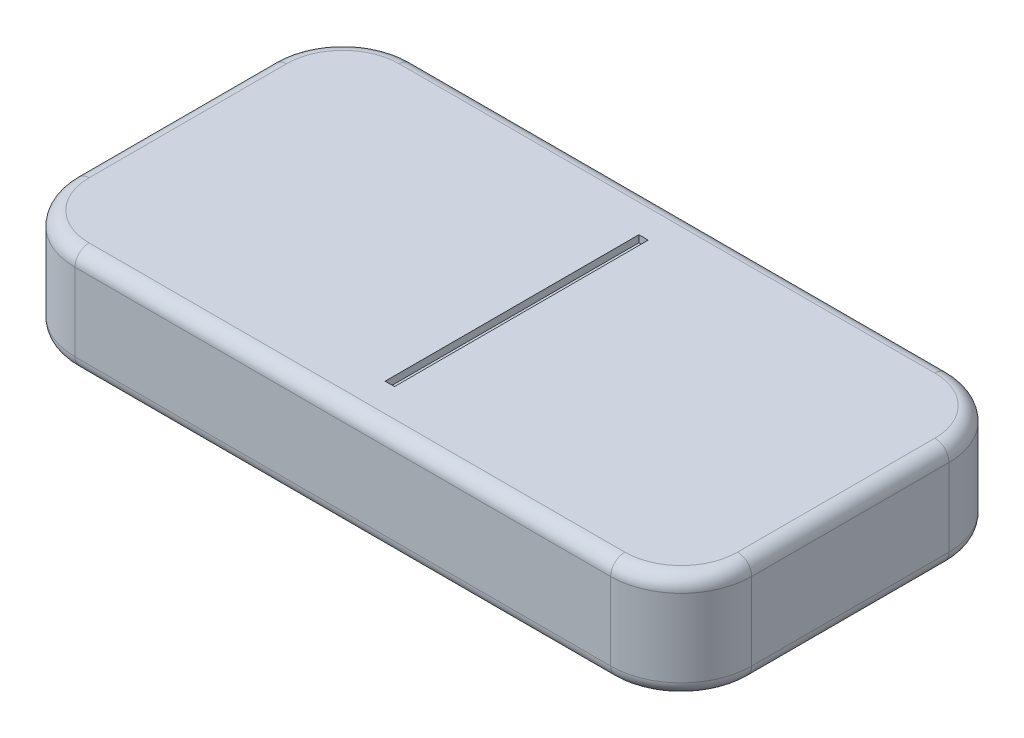
ISO-10303-21;
HEADER;
FILE_DESCRIPTION(('STEP AP214'),'2;1');
FILE_NAME('part.step','',(''),(''),'','','');
FILE_SCHEMA(('AUTOMOTIVE_DESIGN { 1 0 10303 214 1 1 1 1 }'));
ENDSEC;
DATA;
#1=APPLICATION_CONTEXT('core data for automotive mechanical design processes');
#2=APPLICATION_PROTOCOL_DEFINITION('international standard','automotive_design',2000,#1);
#3=PRODUCT_CONTEXT('',#1,'mechanical');
#4=PRODUCT('Part','Part','',(#3));
#5=PRODUCT_RELATED_PRODUCT_CATEGORY('part','',(#4));
#6=PRODUCT_DEFINITION_FORMATION('','',#4);
#7=PRODUCT_DEFINITION_CONTEXT('part definition',#1,'design');
#8=PRODUCT_DEFINITION('design','',#6,#7);
#9=PRODUCT_DEFINITION_SHAPE('','',#8);
#10=(LENGTH_UNIT() NAMED_UNIT(*) SI_UNIT(.MILLI.,.METRE.));
#11=(NAMED_UNIT(*) PLANE_ANGLE_UNIT() SI_UNIT($,.RADIAN.));
#12=(NAMED_UNIT(*) SI_UNIT($,.STERADIAN.) SOLID_ANGLE_UNIT());
#13=UNCERTAINTY_MEASURE_WITH_UNIT(LENGTH_MEASURE(1.E-05),#10,'distance_accuracy_value','');
#14=(GEOMETRIC_REPRESENTATION_CONTEXT(3) GLOBAL_UNCERTAINTY_ASSIGNED_CONTEXT((#13)) GLOBAL_UNIT_ASSIGNED_CONTEXT((#10,
#11,#12)) REPRESENTATION_CONTEXT('',''));
#15=CARTESIAN_POINT('',(0.,0.,0.));
#16=DIRECTION('',(0.,0.,1.));
#17=DIRECTION('',(1.,0.,0.));
#18=AXIS2_PLACEMENT_3D('',#15,#16,#17);
#19=CARTESIAN_POINT('',(0.,7.5,0.));
#20=DIRECTION('',(1.,0.,0.));
#21=DIRECTION('',(0.,0.,-1.));
#22=AXIS2_PLACEMENT_3D('',#19,#20,#21);
#23=PLANE('',#22);
#24=DIRECTION('',(0.,-1.,0.));
#25=VECTOR('',#24,1.);
#26=CARTESIAN_POINT('',(0.,7.5,-19.));
#27=LINE('',#26,#25);
#28=CARTESIAN_POINT('',(0.,6.5,-19.));
#29=VERTEX_POINT('',#28);
#30=CARTESIAN_POINT('',(0.,1.,-19.));
#31=VERTEX_POINT('',#30);
#32=EDGE_CURVE('E247',#29,#31,#27,.T.);
#33=ORIENTED_EDGE('',*,*,#32,.T.);
#34=DIRECTION('',(0.,0.,1.));
#35=VECTOR('',#34,1.);
#36=CARTESIAN_POINT('',(0.,1.,-5.));
#37=LINE('',#36,#35);
#38=CARTESIAN_POINT('',(0.,1.,-5.));
#39=VERTEX_POINT('',#38);
#40=EDGE_CURVE('E378',#31,#39,#37,.T.);
#41=ORIENTED_EDGE('',*,*,#40,.T.);
#42=DIRECTION('',(0.,-1.,0.));
#43=VECTOR('',#42,1.);
#44=CARTESIAN_POINT('',(0.,7.5,-5.));
#45=LINE('',#44,#43);
#46=CARTESIAN_POINT('',(0.,6.5,-5.));
#47=VERTEX_POINT('',#46);
#48=EDGE_CURVE('E251',#39,#47,#45,.F.);
#49=ORIENTED_EDGE('',*,*,#48,.T.);
#50=DIRECTION('',(0.,0.,1.));
#51=VECTOR('',#50,1.);
#52=CARTESIAN_POINT('',(0.,6.5,0.));
#53=LINE('',#52,#51);
#54=EDGE_CURVE('E297',#47,#29,#53,.F.);
#55=ORIENTED_EDGE('',*,*,#54,.T.);
#56=EDGE_LOOP('',(#33,#41,#49,#55));
#57=FACE_BOUND('',#56,.T.);
#58=ADVANCED_FACE('F36',(#57),#23,.F.);
#59=CARTESIAN_POINT('',(0.,7.5,0.));
#60=DIRECTION('',(0.,0.,-1.));
#61=DIRECTION('',(-1.,0.,0.));
#62=AXIS2_PLACEMENT_3D('',#59,#60,#61);
#63=PLANE('',#62);
#64=DIRECTION('',(0.,-1.,0.));
#65=VECTOR('',#64,1.);
#66=CARTESIAN_POINT('',(5.,7.5,0.));
#67=LINE('',#66,#65);
#68=CARTESIAN_POINT('',(5.,6.5,0.));
#69=VERTEX_POINT('',#68);
#70=CARTESIAN_POINT('',(5.,1.,0.));
#71=VERTEX_POINT('',#70);
#72=EDGE_CURVE('E234',#69,#71,#67,.T.);
#73=ORIENTED_EDGE('',*,*,#72,.T.);
#74=DIRECTION('',(1.,0.,0.));
#75=VECTOR('',#74,1.);
#76=CARTESIAN_POINT('',(43.,1.,0.));
#77=LINE('',#76,#75);
#78=CARTESIAN_POINT('',(43.,1.,0.));
#79=VERTEX_POINT('',#78);
#80=EDGE_CURVE('E372',#71,#79,#77,.T.);
#81=ORIENTED_EDGE('',*,*,#80,.T.);
#82=DIRECTION('',(0.,-1.,0.));
#83=VECTOR('',#82,1.);
#84=CARTESIAN_POINT('',(43.,7.5,0.));
#85=LINE('',#84,#83);
#86=CARTESIAN_POINT('',(43.,6.5,0.));
#87=VERTEX_POINT('',#86);
#88=EDGE_CURVE('E238',#79,#87,#85,.F.);
#89=ORIENTED_EDGE('',*,*,#88,.T.);
#90=DIRECTION('',(1.,0.,0.));
#91=VECTOR('',#90,1.);
#92=CARTESIAN_POINT('',(0.,6.5,0.));
#93=LINE('',#92,#91);
#94=EDGE_CURVE('E290',#87,#69,#93,.F.);
#95=ORIENTED_EDGE('',*,*,#94,.T.);
#96=EDGE_LOOP('',(#73,#81,#89,#95));
#97=FACE_BOUND('',#96,.T.);
#98=ADVANCED_FACE('F427',(#97),#63,.F.);
#99=CARTESIAN_POINT('',(48.,7.5,0.));
#100=DIRECTION('',(-1.,0.,0.));
#101=DIRECTION('',(0.,0.,1.));
#102=AXIS2_PLACEMENT_3D('',#99,#100,#101);
#103=PLANE('',#102);
#104=DIRECTION('',(0.,-1.,0.));
#105=VECTOR('',#104,1.);
#106=CARTESIAN_POINT('',(48.,7.5,-5.));
#107=LINE('',#106,#105);
#108=CARTESIAN_POINT('',(48.,6.5,-5.));
#109=VERTEX_POINT('',#108);
#110=CARTESIAN_POINT('',(48.,1.,-5.));
#111=VERTEX_POINT('',#110);
#112=EDGE_CURVE('E229',#109,#111,#107,.T.);
#113=ORIENTED_EDGE('',*,*,#112,.T.);
#114=DIRECTION('',(0.,0.,-1.));
#115=VECTOR('',#114,1.);
#116=CARTESIAN_POINT('',(48.,1.,-19.));
#117=LINE('',#116,#115);
#118=CARTESIAN_POINT('',(48.,1.,-19.));
#119=VERTEX_POINT('',#118);
#120=EDGE_CURVE('E366',#111,#119,#117,.T.);
#121=ORIENTED_EDGE('',*,*,#120,.T.);
#122=DIRECTION('',(0.,-1.,0.));
#123=VECTOR('',#122,1.);
#124=CARTESIAN_POINT('',(48.,7.5,-19.));
#125=LINE('',#124,#123);
#126=CARTESIAN_POINT('',(48.,6.5,-19.));
#127=VERTEX_POINT('',#126);
#128=EDGE_CURVE('E226',#119,#127,#125,.F.);
#129=ORIENTED_EDGE('',*,*,#128,.T.);
#130=DIRECTION('',(0.,0.,-1.));
#131=VECTOR('',#130,1.);
#132=CARTESIAN_POINT('',(48.,6.5,0.));
#133=LINE('',#132,#131);
#134=EDGE_CURVE('E283',#127,#109,#133,.F.);
#135=ORIENTED_EDGE('',*,*,#134,.T.);
#136=EDGE_LOOP('',(#113,#121,#129,#135));
#137=FACE_BOUND('',#136,.T.);
#138=ADVANCED_FACE('F483',(#137),#103,.F.);
#139=CARTESIAN_POINT('',(0.,7.5,-24.));
#140=DIRECTION('',(0.,0.,1.));
#141=DIRECTION('',(1.,0.,0.));
#142=AXIS2_PLACEMENT_3D('',#139,#140,#141);
#143=PLANE('',#142);
#144=DIRECTION('',(0.,-1.,0.));
#145=VECTOR('',#144,1.);
#146=CARTESIAN_POINT('',(43.,7.5,-24.));
#147=LINE('',#146,#145);
#148=CARTESIAN_POINT('',(43.,6.5,-24.));
#149=VERTEX_POINT('',#148);
#150=CARTESIAN_POINT('',(43.,1.,-24.));
#151=VERTEX_POINT('',#150);
#152=EDGE_CURVE('E244',#149,#151,#147,.T.);
#153=ORIENTED_EDGE('',*,*,#152,.T.);
#154=DIRECTION('',(-1.,0.,0.));
#155=VECTOR('',#154,1.);
#156=CARTESIAN_POINT('',(4.99999999999999,1.,-24.));
#157=LINE('',#156,#155);
#158=CARTESIAN_POINT('',(4.99999999999999,1.,-24.));
#159=VERTEX_POINT('',#158);
#160=EDGE_CURVE('E11',#151,#159,#157,.T.);
#161=ORIENTED_EDGE('',*,*,#160,.T.);
#162=DIRECTION('',(0.,-1.,0.));
#163=VECTOR('',#162,1.);
#164=CARTESIAN_POINT('',(4.99999999999999,7.5,-24.));
#165=LINE('',#164,#163);
#166=CARTESIAN_POINT('',(4.99999999999999,6.5,-24.));
#167=VERTEX_POINT('',#166);
#168=EDGE_CURVE('E241',#159,#167,#165,.F.);
#169=ORIENTED_EDGE('',*,*,#168,.T.);
#170=DIRECTION('',(-1.,0.,0.));
#171=VECTOR('',#170,1.);
#172=CARTESIAN_POINT('',(0.,6.5,-24.));
#173=LINE('',#172,#171);
#174=EDGE_CURVE('E304',#167,#149,#173,.F.);
#175=ORIENTED_EDGE('',*,*,#174,.T.);
#176=EDGE_LOOP('',(#153,#161,#169,#175));
#177=FACE_BOUND('',#176,.T.);
#178=ADVANCED_FACE('F723',(#177),#143,.F.);
#179=CARTESIAN_POINT('',(0.,7.5,-24.));
#180=DIRECTION('',(0.,-1.,0.));
#181=DIRECTION('',(0.,0.,-1.));
#182=AXIS2_PLACEMENT_3D('',#179,#180,#181);
#183=PLANE('',#182);
#184=DIRECTION('',(1.,0.,0.));
#185=VECTOR('',#184,1.);
#186=CARTESIAN_POINT('',(24.,7.5,-3.));
#187=LINE('',#186,#185);
#188=CARTESIAN_POINT('',(24.,7.5,-3.));
#189=VERTEX_POINT('',#188);
#190=CARTESIAN_POINT('',(24.6621919778605,7.5,-3.));
#191=VERTEX_POINT('',#190);
#192=EDGE_CURVE('E211',#189,#191,#187,.T.);
#193=ORIENTED_EDGE('',*,*,#192,.F.);
#194=DIRECTION('',(0.,0.,1.));
#195=VECTOR('',#194,1.);
#196=CARTESIAN_POINT('',(24.,7.5,-21.));
#197=LINE('',#196,#195);
#198=CARTESIAN_POINT('',(24.,7.5,-21.));
#199=VERTEX_POINT('',#198);
#200=EDGE_CURVE('E54',#199,#189,#197,.T.);
#201=ORIENTED_EDGE('',*,*,#200,.F.);
#202=DIRECTION('',(-1.,0.,0.));
#203=VECTOR('',#202,1.);
#204=CARTESIAN_POINT('',(24.,7.5,-21.));
#205=LINE('',#204,#203);
#206=CARTESIAN_POINT('',(24.6621919778605,7.5,-21.));
#207=VERTEX_POINT('',#206);
#208=EDGE_CURVE('E198',#207,#199,#205,.T.);
#209=ORIENTED_EDGE('',*,*,#208,.F.);
#210=DIRECTION('',(0.,0.,-1.));
#211=VECTOR('',#210,1.);
#212=CARTESIAN_POINT('',(24.6621919778605,7.5,-21.));
#213=LINE('',#212,#211);
#214=EDGE_CURVE('E202',#191,#207,#213,.T.);
#215=ORIENTED_EDGE('',*,*,#214,.F.);
#216=EDGE_LOOP('',(#193,#201,#209,#215));
#217=FACE_BOUND('',#216,.T.);
#218=DIRECTION('',(0.,0.,-1.));
#219=VECTOR('',#218,1.);
#220=CARTESIAN_POINT('',(47.,7.5,-24.));
#221=LINE('',#220,#219);
#222=CARTESIAN_POINT('',(47.,7.5,-5.));
#223=VERTEX_POINT('',#222);
#224=CARTESIAN_POINT('',(47.,7.5,-19.));
#225=VERTEX_POINT('',#224);
#226=EDGE_CURVE('E272',#223,#225,#221,.T.);
#227=ORIENTED_EDGE('',*,*,#226,.T.);
#228=CARTESIAN_POINT('',(43.,7.5,-19.));
#229=DIRECTION('',(0.,-1.,0.));
#230=DIRECTION('',(0.,0.,-1.));
#231=AXIS2_PLACEMENT_3D('',#228,#229,#230);
#232=CIRCLE('',#231,4.);
#233=CARTESIAN_POINT('',(43.,7.5,-23.));
#234=VERTEX_POINT('',#233);
#235=EDGE_CURVE('E275',#225,#234,#232,.F.);
#236=ORIENTED_EDGE('',*,*,#235,.T.);
#237=DIRECTION('',(-1.,0.,0.));
#238=VECTOR('',#237,1.);
#239=CARTESIAN_POINT('',(0.,7.5,-23.));
#240=LINE('',#239,#238);
#241=CARTESIAN_POINT('',(4.99999999999999,7.5,-23.));
#242=VERTEX_POINT('',#241);
#243=EDGE_CURVE('E254',#234,#242,#240,.T.);
#244=ORIENTED_EDGE('',*,*,#243,.T.);
#245=CARTESIAN_POINT('',(4.99999999999999,7.5,-19.));
#246=DIRECTION('',(0.,-1.,0.));
#247=DIRECTION('',(0.,0.,-1.));
#248=AXIS2_PLACEMENT_3D('',#245,#246,#247);
#249=CIRCLE('',#248,4.);
#250=CARTESIAN_POINT('',(0.999999999999989,7.5,-19.));
#251=VERTEX_POINT('',#250);
#252=EDGE_CURVE('E257',#242,#251,#249,.F.);
#253=ORIENTED_EDGE('',*,*,#252,.T.);
#254=DIRECTION('',(0.,0.,1.));
#255=VECTOR('',#254,1.);
#256=CARTESIAN_POINT('',(0.999999999999986,7.5,-24.));
#257=LINE('',#256,#255);
#258=CARTESIAN_POINT('',(0.999999999999997,7.5,-5.));
#259=VERTEX_POINT('',#258);
#260=EDGE_CURVE('E260',#251,#259,#257,.T.);
#261=ORIENTED_EDGE('',*,*,#260,.T.);
#262=CARTESIAN_POINT('',(5.,7.5,-5.));
#263=DIRECTION('',(0.,-1.,0.));
#264=DIRECTION('',(0.,0.,-1.));
#265=AXIS2_PLACEMENT_3D('',#262,#263,#264);
#266=CIRCLE('',#265,4.);
#267=CARTESIAN_POINT('',(5.,7.5,-1.));
#268=VERTEX_POINT('',#267);
#269=EDGE_CURVE('E263',#259,#268,#266,.F.);
#270=ORIENTED_EDGE('',*,*,#269,.T.);
#271=DIRECTION('',(1.,0.,0.));
#272=VECTOR('',#271,1.);
#273=CARTESIAN_POINT('',(0.,7.5,-1.));
#274=LINE('',#273,#272);
#275=CARTESIAN_POINT('',(43.,7.5,-1.));
#276=VERTEX_POINT('',#275);
#277=EDGE_CURVE('E266',#268,#276,#274,.T.);
#278=ORIENTED_EDGE('',*,*,#277,.T.);
#279=CARTESIAN_POINT('',(43.,7.5,-5.));
#280=DIRECTION('',(0.,-1.,0.));
#281=DIRECTION('',(0.,0.,-1.));
#282=AXIS2_PLACEMENT_3D('',#279,#280,#281);
#283=CIRCLE('',#282,4.);
#284=EDGE_CURVE('E269',#276,#223,#283,.F.);
#285=ORIENTED_EDGE('',*,*,#284,.T.);
#286=EDGE_LOOP('',(#227,#236,#244,#253,#261,#270,#278,#285));
#287=FACE_BOUND('',#286,.T.);
#288=ADVANCED_FACE('F442',(#217,#287),#183,.F.);
#289=CARTESIAN_POINT('',(0.,0.,-24.));
#290=DIRECTION('',(0.,-1.,0.));
#291=DIRECTION('',(0.,0.,-1.));
#292=AXIS2_PLACEMENT_3D('',#289,#290,#291);
#293=PLANE('',#292);
#294=DIRECTION('',(-1.,0.,0.));
#295=VECTOR('',#294,1.);
#296=CARTESIAN_POINT('',(43.,0.,-23.));
#297=LINE('',#296,#295);
#298=CARTESIAN_POINT('',(4.99999999999999,0.,-23.));
#299=VERTEX_POINT('',#298);
#300=CARTESIAN_POINT('',(43.,0.,-23.));
#301=VERTEX_POINT('',#300);
#302=EDGE_CURVE('E307',#299,#301,#297,.F.);
#303=ORIENTED_EDGE('',*,*,#302,.T.);
#304=CARTESIAN_POINT('',(43.,0.,-19.));
#305=DIRECTION('',(0.,-1.,0.));
#306=DIRECTION('',(0.,0.,-1.));
#307=AXIS2_PLACEMENT_3D('',#304,#305,#306);
#308=CIRCLE('',#307,4.);
#309=CARTESIAN_POINT('',(47.,0.,-19.));
#310=VERTEX_POINT('',#309);
#311=EDGE_CURVE('E358',#301,#310,#308,.T.);
#312=ORIENTED_EDGE('',*,*,#311,.T.);
#313=DIRECTION('',(0.,0.,-1.));
#314=VECTOR('',#313,1.);
#315=CARTESIAN_POINT('',(47.,0.,-5.));
#316=LINE('',#315,#314);
#317=CARTESIAN_POINT('',(47.,0.,-5.));
#318=VERTEX_POINT('',#317);
#319=EDGE_CURVE('E355',#310,#318,#316,.F.);
#320=ORIENTED_EDGE('',*,*,#319,.T.);
#321=CARTESIAN_POINT('',(43.,0.,-5.));
#322=DIRECTION('',(0.,-1.,0.));
#323=DIRECTION('',(0.,0.,-1.));
#324=AXIS2_PLACEMENT_3D('',#321,#322,#323);
#325=CIRCLE('',#324,4.);
#326=CARTESIAN_POINT('',(43.,0.,-1.));
#327=VERTEX_POINT('',#326);
#328=EDGE_CURVE('E352',#318,#327,#325,.T.);
#329=ORIENTED_EDGE('',*,*,#328,.T.);
#330=DIRECTION('',(1.,0.,0.));
#331=VECTOR('',#330,1.);
#332=CARTESIAN_POINT('',(5.,0.,-1.));
#333=LINE('',#332,#331);
#334=CARTESIAN_POINT('',(5.,0.,-1.));
#335=VERTEX_POINT('',#334);
#336=EDGE_CURVE('E349',#327,#335,#333,.F.);
#337=ORIENTED_EDGE('',*,*,#336,.T.);
#338=CARTESIAN_POINT('',(5.,0.,-5.));
#339=DIRECTION('',(0.,-1.,0.));
#340=DIRECTION('',(0.,0.,-1.));
#341=AXIS2_PLACEMENT_3D('',#338,#339,#340);
#342=CIRCLE('',#341,4.);
#343=CARTESIAN_POINT('',(0.999999999999997,0.,-5.));
#344=VERTEX_POINT('',#343);
#345=EDGE_CURVE('E346',#335,#344,#342,.T.);
#346=ORIENTED_EDGE('',*,*,#345,.T.);
#347=DIRECTION('',(0.,0.,1.));
#348=VECTOR('',#347,1.);
#349=CARTESIAN_POINT('',(0.999999999999989,0.,-19.));
#350=LINE('',#349,#348);
#351=CARTESIAN_POINT('',(0.999999999999989,0.,-19.));
#352=VERTEX_POINT('',#351);
#353=EDGE_CURVE('E343',#344,#352,#350,.F.);
#354=ORIENTED_EDGE('',*,*,#353,.T.);
#355=CARTESIAN_POINT('',(4.99999999999999,0.,-19.));
#356=DIRECTION('',(0.,-1.,0.));
#357=DIRECTION('',(0.,0.,-1.));
#358=AXIS2_PLACEMENT_3D('',#355,#356,#357);
#359=CIRCLE('',#358,4.);
#360=EDGE_CURVE('E340',#352,#299,#359,.T.);
#361=ORIENTED_EDGE('',*,*,#360,.T.);
#362=EDGE_LOOP('',(#303,#312,#320,#329,#337,#346,#354,#361));
#363=FACE_BOUND('',#362,.T.);
#364=ADVANCED_FACE('F470',(#363),#293,.T.);
#365=CARTESIAN_POINT('',(43.,7.5,-5.));
#366=DIRECTION('',(0.,-1.,0.));
#367=DIRECTION('',(0.,0.,-1.));
#368=AXIS2_PLACEMENT_3D('',#365,#366,#367);
#369=CYLINDRICAL_SURFACE('',#368,5.);
#370=ORIENTED_EDGE('',*,*,#88,.F.);
#371=CARTESIAN_POINT('',(43.,1.,-5.));
#372=DIRECTION('',(0.,-1.,0.));
#373=DIRECTION('',(0.,0.,-1.));
#374=AXIS2_PLACEMENT_3D('',#371,#372,#373);
#375=CIRCLE('',#374,5.);
#376=EDGE_CURVE('E369',#79,#111,#375,.F.);
#377=ORIENTED_EDGE('',*,*,#376,.T.);
#378=ORIENTED_EDGE('',*,*,#112,.F.);
#379=CARTESIAN_POINT('',(43.,6.5,-5.));
#380=DIRECTION('',(0.,-1.,0.));
#381=DIRECTION('',(0.,0.,-1.));
#382=AXIS2_PLACEMENT_3D('',#379,#380,#381);
#383=CIRCLE('',#382,5.);
#384=EDGE_CURVE('E286',#109,#87,#383,.T.);
#385=ORIENTED_EDGE('',*,*,#384,.T.);
#386=EDGE_LOOP('',(#370,#377,#378,#385));
#387=FACE_BOUND('',#386,.T.);
#388=ADVANCED_FACE('F481',(#387),#369,.T.);
#389=CARTESIAN_POINT('',(43.,7.5,-19.));
#390=DIRECTION('',(0.,-1.,0.));
#391=DIRECTION('',(0.,0.,-1.));
#392=AXIS2_PLACEMENT_3D('',#389,#390,#391);
#393=CYLINDRICAL_SURFACE('',#392,5.);
#394=ORIENTED_EDGE('',*,*,#128,.F.);
#395=CARTESIAN_POINT('',(43.,1.,-19.));
#396=DIRECTION('',(0.,-1.,0.));
#397=DIRECTION('',(0.,0.,-1.));
#398=AXIS2_PLACEMENT_3D('',#395,#396,#397);
#399=CIRCLE('',#398,5.);
#400=EDGE_CURVE('E362',#119,#151,#399,.F.);
#401=ORIENTED_EDGE('',*,*,#400,.T.);
#402=ORIENTED_EDGE('',*,*,#152,.F.);
#403=CARTESIAN_POINT('',(43.,6.5,-19.));
#404=DIRECTION('',(0.,-1.,0.));
#405=DIRECTION('',(0.,0.,-1.));
#406=AXIS2_PLACEMENT_3D('',#403,#404,#405);
#407=CIRCLE('',#406,5.);
#408=EDGE_CURVE('E279',#149,#127,#407,.T.);
#409=ORIENTED_EDGE('',*,*,#408,.T.);
#410=EDGE_LOOP('',(#394,#401,#402,#409));
#411=FACE_BOUND('',#410,.T.);
#412=ADVANCED_FACE('F492',(#411),#393,.T.);
#413=CARTESIAN_POINT('',(5.,7.5,-5.));
#414=DIRECTION('',(0.,-1.,0.));
#415=DIRECTION('',(0.,0.,-1.));
#416=AXIS2_PLACEMENT_3D('',#413,#414,#415);
#417=CYLINDRICAL_SURFACE('',#416,5.);
#418=ORIENTED_EDGE('',*,*,#48,.F.);
#419=CARTESIAN_POINT('',(5.,1.,-5.));
#420=DIRECTION('',(0.,-1.,0.));
#421=DIRECTION('',(0.,0.,-1.));
#422=AXIS2_PLACEMENT_3D('',#419,#420,#421);
#423=CIRCLE('',#422,5.);
#424=EDGE_CURVE('E375',#39,#71,#423,.F.);
#425=ORIENTED_EDGE('',*,*,#424,.T.);
#426=ORIENTED_EDGE('',*,*,#72,.F.);
#427=CARTESIAN_POINT('',(5.,6.5,-5.));
#428=DIRECTION('',(0.,-1.,0.));
#429=DIRECTION('',(0.,0.,-1.));
#430=AXIS2_PLACEMENT_3D('',#427,#428,#429);
#431=CIRCLE('',#430,5.);
#432=EDGE_CURVE('E293',#69,#47,#431,.T.);
#433=ORIENTED_EDGE('',*,*,#432,.T.);
#434=EDGE_LOOP('',(#418,#425,#426,#433));
#435=FACE_BOUND('',#434,.T.);
#436=ADVANCED_FACE('F424',(#435),#417,.T.);
#437=CARTESIAN_POINT('',(4.99999999999999,7.5,-19.));
#438=DIRECTION('',(0.,-1.,0.));
#439=DIRECTION('',(0.,0.,-1.));
#440=AXIS2_PLACEMENT_3D('',#437,#438,#439);
#441=CYLINDRICAL_SURFACE('',#440,5.);
#442=ORIENTED_EDGE('',*,*,#168,.F.);
#443=CARTESIAN_POINT('',(4.99999999999999,1.,-19.));
#444=DIRECTION('',(0.,-1.,0.));
#445=DIRECTION('',(0.,0.,-1.));
#446=AXIS2_PLACEMENT_3D('',#443,#444,#445);
#447=CIRCLE('',#446,5.);
#448=EDGE_CURVE('E46',#159,#31,#447,.F.);
#449=ORIENTED_EDGE('',*,*,#448,.T.);
#450=ORIENTED_EDGE('',*,*,#32,.F.);
#451=CARTESIAN_POINT('',(4.99999999999999,6.5,-19.));
#452=DIRECTION('',(0.,-1.,0.));
#453=DIRECTION('',(0.,0.,-1.));
#454=AXIS2_PLACEMENT_3D('',#451,#452,#453);
#455=CIRCLE('',#454,5.);
#456=EDGE_CURVE('E300',#29,#167,#455,.T.);
#457=ORIENTED_EDGE('',*,*,#456,.T.);
#458=EDGE_LOOP('',(#442,#449,#450,#457));
#459=FACE_BOUND('',#458,.T.);
#460=ADVANCED_FACE('F457',(#459),#441,.T.);
#461=CARTESIAN_POINT('',(5.,6.5,-5.));
#462=DIRECTION('',(0.,-1.,0.));
#463=DIRECTION('',(0.,0.,-1.));
#464=AXIS2_PLACEMENT_3D('',#461,#462,#463);
#465=TOROIDAL_SURFACE('',#464,4.,1.);
#466=CARTESIAN_POINT('',(0.999999999999997,6.5,-5.));
#467=DIRECTION('',(0.,0.,-1.));
#468=DIRECTION('',(-1.,0.,0.));
#469=AXIS2_PLACEMENT_3D('',#466,#467,#468);
#470=CIRCLE('',#469,1.);
#471=EDGE_CURVE('E331',#47,#259,#470,.T.);
#472=ORIENTED_EDGE('',*,*,#471,.F.);
#473=ORIENTED_EDGE('',*,*,#432,.F.);
#474=CARTESIAN_POINT('',(5.,6.5,-1.));
#475=DIRECTION('',(1.,0.,0.));
#476=DIRECTION('',(0.,0.,-1.));
#477=AXIS2_PLACEMENT_3D('',#474,#475,#476);
#478=CIRCLE('',#477,1.);
#479=EDGE_CURVE('E230',#268,#69,#478,.T.);
#480=ORIENTED_EDGE('',*,*,#479,.F.);
#481=ORIENTED_EDGE('',*,*,#269,.F.);
#482=EDGE_LOOP('',(#472,#473,#480,#481));
#483=FACE_BOUND('',#482,.T.);
#484=ADVANCED_FACE('F448',(#483),#465,.T.);
#485=CARTESIAN_POINT('',(0.,6.5,-1.));
#486=DIRECTION('',(1.,0.,0.));
#487=DIRECTION('',(0.,0.,-1.));
#488=AXIS2_PLACEMENT_3D('',#485,#486,#487);
#489=CYLINDRICAL_SURFACE('',#488,1.);
#490=ORIENTED_EDGE('',*,*,#479,.T.);
#491=ORIENTED_EDGE('',*,*,#94,.F.);
#492=CARTESIAN_POINT('',(43.,6.5,-1.));
#493=DIRECTION('',(1.,0.,0.));
#494=DIRECTION('',(0.,0.,-1.));
#495=AXIS2_PLACEMENT_3D('',#492,#493,#494);
#496=CIRCLE('',#495,1.);
#497=EDGE_CURVE('E327',#276,#87,#496,.T.);
#498=ORIENTED_EDGE('',*,*,#497,.F.);
#499=ORIENTED_EDGE('',*,*,#277,.F.);
#500=EDGE_LOOP('',(#490,#491,#498,#499));
#501=FACE_BOUND('',#500,.T.);
#502=ADVANCED_FACE('F432',(#501),#489,.T.);
#503=CARTESIAN_POINT('',(0.999999999999986,6.5,-24.));
#504=DIRECTION('',(0.,0.,1.));
#505=DIRECTION('',(1.,0.,0.));
#506=AXIS2_PLACEMENT_3D('',#503,#504,#505);
#507=CYLINDRICAL_SURFACE('',#506,1.);
#508=ORIENTED_EDGE('',*,*,#471,.T.);
#509=ORIENTED_EDGE('',*,*,#260,.F.);
#510=CARTESIAN_POINT('',(0.999999999999989,6.5,-19.));
#511=DIRECTION('',(0.,0.,-1.));
#512=DIRECTION('',(-1.,0.,0.));
#513=AXIS2_PLACEMENT_3D('',#510,#511,#512);
#514=CIRCLE('',#513,1.);
#515=EDGE_CURVE('E323',#29,#251,#514,.T.);
#516=ORIENTED_EDGE('',*,*,#515,.F.);
#517=ORIENTED_EDGE('',*,*,#54,.F.);
#518=EDGE_LOOP('',(#508,#509,#516,#517));
#519=FACE_BOUND('',#518,.T.);
#520=ADVANCED_FACE('F452',(#519),#507,.T.);
#521=CARTESIAN_POINT('',(43.,6.5,-5.));
#522=DIRECTION('',(0.,-1.,0.));
#523=DIRECTION('',(0.,0.,-1.));
#524=AXIS2_PLACEMENT_3D('',#521,#522,#523);
#525=TOROIDAL_SURFACE('',#524,4.,1.);
#526=ORIENTED_EDGE('',*,*,#497,.T.);
#527=ORIENTED_EDGE('',*,*,#384,.F.);
#528=CARTESIAN_POINT('',(47.,6.5,-5.));
#529=DIRECTION('',(0.,0.,-1.));
#530=DIRECTION('',(-1.,0.,0.));
#531=AXIS2_PLACEMENT_3D('',#528,#529,#530);
#532=CIRCLE('',#531,1.);
#533=EDGE_CURVE('E319',#223,#109,#532,.T.);
#534=ORIENTED_EDGE('',*,*,#533,.F.);
#535=ORIENTED_EDGE('',*,*,#284,.F.);
#536=EDGE_LOOP('',(#526,#527,#534,#535));
#537=FACE_BOUND('',#536,.T.);
#538=ADVANCED_FACE('F438',(#537),#525,.T.);
#539=CARTESIAN_POINT('',(4.99999999999999,6.5,-19.));
#540=DIRECTION('',(0.,-1.,0.));
#541=DIRECTION('',(0.,0.,-1.));
#542=AXIS2_PLACEMENT_3D('',#539,#540,#541);
#543=TOROIDAL_SURFACE('',#542,4.,1.);
#544=ORIENTED_EDGE('',*,*,#515,.T.);
#545=ORIENTED_EDGE('',*,*,#252,.F.);
#546=CARTESIAN_POINT('',(4.99999999999999,6.5,-23.));
#547=DIRECTION('',(1.,0.,0.));
#548=DIRECTION('',(0.,0.,-1.));
#549=AXIS2_PLACEMENT_3D('',#546,#547,#548);
#550=CIRCLE('',#549,1.);
#551=EDGE_CURVE('E315',#167,#242,#550,.T.);
#552=ORIENTED_EDGE('',*,*,#551,.F.);
#553=ORIENTED_EDGE('',*,*,#456,.F.);
#554=EDGE_LOOP('',(#544,#545,#552,#553));
#555=FACE_BOUND('',#554,.T.);
#556=ADVANCED_FACE('F503',(#555),#543,.T.);
#557=CARTESIAN_POINT('',(47.,6.5,-24.));
#558=DIRECTION('',(0.,0.,-1.));
#559=DIRECTION('',(-1.,0.,0.));
#560=AXIS2_PLACEMENT_3D('',#557,#558,#559);
#561=CYLINDRICAL_SURFACE('',#560,1.);
#562=ORIENTED_EDGE('',*,*,#533,.T.);
#563=ORIENTED_EDGE('',*,*,#134,.F.);
#564=CARTESIAN_POINT('',(47.,6.5,-19.));
#565=DIRECTION('',(0.,0.,-1.));
#566=DIRECTION('',(-1.,0.,0.));
#567=AXIS2_PLACEMENT_3D('',#564,#565,#566);
#568=CIRCLE('',#567,1.);
#569=EDGE_CURVE('E311',#225,#127,#568,.T.);
#570=ORIENTED_EDGE('',*,*,#569,.F.);
#571=ORIENTED_EDGE('',*,*,#226,.F.);
#572=EDGE_LOOP('',(#562,#563,#570,#571));
#573=FACE_BOUND('',#572,.T.);
#574=ADVANCED_FACE('F487',(#573),#561,.T.);
#575=CARTESIAN_POINT('',(0.,6.5,-23.));
#576=DIRECTION('',(-1.,0.,0.));
#577=DIRECTION('',(0.,0.,1.));
#578=AXIS2_PLACEMENT_3D('',#575,#576,#577);
#579=CYLINDRICAL_SURFACE('',#578,1.);
#580=ORIENTED_EDGE('',*,*,#551,.T.);
#581=ORIENTED_EDGE('',*,*,#243,.F.);
#582=CARTESIAN_POINT('',(43.,6.5,-23.));
#583=DIRECTION('',(1.,0.,0.));
#584=DIRECTION('',(0.,0.,-1.));
#585=AXIS2_PLACEMENT_3D('',#582,#583,#584);
#586=CIRCLE('',#585,1.);
#587=EDGE_CURVE('E308',#149,#234,#586,.T.);
#588=ORIENTED_EDGE('',*,*,#587,.F.);
#589=ORIENTED_EDGE('',*,*,#174,.F.);
#590=EDGE_LOOP('',(#580,#581,#588,#589));
#591=FACE_BOUND('',#590,.T.);
#592=ADVANCED_FACE('F500',(#591),#579,.T.);
#593=CARTESIAN_POINT('',(43.,6.5,-19.));
#594=DIRECTION('',(0.,-1.,0.));
#595=DIRECTION('',(0.,0.,-1.));
#596=AXIS2_PLACEMENT_3D('',#593,#594,#595);
#597=TOROIDAL_SURFACE('',#596,4.,1.);
#598=ORIENTED_EDGE('',*,*,#569,.T.);
#599=ORIENTED_EDGE('',*,*,#408,.F.);
#600=ORIENTED_EDGE('',*,*,#587,.T.);
#601=ORIENTED_EDGE('',*,*,#235,.F.);
#602=EDGE_LOOP('',(#598,#599,#600,#601));
#603=FACE_BOUND('',#602,.T.);
#604=ADVANCED_FACE('F496',(#603),#597,.T.);
#605=CARTESIAN_POINT('',(5.,1.,-5.));
#606=DIRECTION('',(0.,-1.,0.));
#607=DIRECTION('',(0.,0.,-1.));
#608=AXIS2_PLACEMENT_3D('',#605,#606,#607);
#609=TOROIDAL_SURFACE('',#608,4.,1.);
#610=CARTESIAN_POINT('',(5.,1.,-1.));
#611=DIRECTION('',(1.,0.,0.));
#612=DIRECTION('',(0.,0.,-1.));
#613=AXIS2_PLACEMENT_3D('',#610,#611,#612);
#614=CIRCLE('',#613,1.);
#615=EDGE_CURVE('E403',#71,#335,#614,.T.);
#616=ORIENTED_EDGE('',*,*,#615,.F.);
#617=ORIENTED_EDGE('',*,*,#424,.F.);
#618=CARTESIAN_POINT('',(0.999999999999997,1.,-5.));
#619=DIRECTION('',(0.,0.,-1.));
#620=DIRECTION('',(-1.,0.,0.));
#621=AXIS2_PLACEMENT_3D('',#618,#619,#620);
#622=CIRCLE('',#621,1.);
#623=EDGE_CURVE('E40',#344,#39,#622,.T.);
#624=ORIENTED_EDGE('',*,*,#623,.F.);
#625=ORIENTED_EDGE('',*,*,#345,.F.);
#626=EDGE_LOOP('',(#616,#617,#624,#625));
#627=FACE_BOUND('',#626,.T.);
#628=ADVANCED_FACE('F38',(#627),#609,.T.);
#629=CARTESIAN_POINT('',(1.,1.,0.));
#630=DIRECTION('',(0.,0.,-1.));
#631=DIRECTION('',(-1.,0.,0.));
#632=AXIS2_PLACEMENT_3D('',#629,#630,#631);
#633=CYLINDRICAL_SURFACE('',#632,1.);
#634=ORIENTED_EDGE('',*,*,#623,.T.);
#635=ORIENTED_EDGE('',*,*,#40,.F.);
#636=CARTESIAN_POINT('',(0.999999999999989,1.,-19.));
#637=DIRECTION('',(0.,0.,-1.));
#638=DIRECTION('',(-1.,0.,0.));
#639=AXIS2_PLACEMENT_3D('',#636,#637,#638);
#640=CIRCLE('',#639,1.);
#641=EDGE_CURVE('E400',#352,#31,#640,.T.);
#642=ORIENTED_EDGE('',*,*,#641,.F.);
#643=ORIENTED_EDGE('',*,*,#353,.F.);
#644=EDGE_LOOP('',(#634,#635,#642,#643));
#645=FACE_BOUND('',#644,.T.);
#646=ADVANCED_FACE('F416',(#645),#633,.T.);
#647=CARTESIAN_POINT('',(0.,1.,-1.));
#648=DIRECTION('',(-1.,0.,0.));
#649=DIRECTION('',(0.,0.,1.));
#650=AXIS2_PLACEMENT_3D('',#647,#648,#649);
#651=CYLINDRICAL_SURFACE('',#650,1.);
#652=ORIENTED_EDGE('',*,*,#615,.T.);
#653=ORIENTED_EDGE('',*,*,#336,.F.);
#654=CARTESIAN_POINT('',(43.,1.,-1.));
#655=DIRECTION('',(1.,0.,0.));
#656=DIRECTION('',(0.,0.,-1.));
#657=AXIS2_PLACEMENT_3D('',#654,#655,#656);
#658=CIRCLE('',#657,1.);
#659=EDGE_CURVE('E396',#79,#327,#658,.T.);
#660=ORIENTED_EDGE('',*,*,#659,.F.);
#661=ORIENTED_EDGE('',*,*,#80,.F.);
#662=EDGE_LOOP('',(#652,#653,#660,#661));
#663=FACE_BOUND('',#662,.T.);
#664=ADVANCED_FACE('F473',(#663),#651,.T.);
#665=CARTESIAN_POINT('',(4.99999999999999,1.,-19.));
#666=DIRECTION('',(0.,-1.,0.));
#667=DIRECTION('',(0.,0.,-1.));
#668=AXIS2_PLACEMENT_3D('',#665,#666,#667);
#669=TOROIDAL_SURFACE('',#668,4.,1.);
#670=ORIENTED_EDGE('',*,*,#641,.T.);
#671=ORIENTED_EDGE('',*,*,#448,.F.);
#672=CARTESIAN_POINT('',(4.99999999999999,1.,-23.));
#673=DIRECTION('',(1.,0.,0.));
#674=DIRECTION('',(0.,0.,-1.));
#675=AXIS2_PLACEMENT_3D('',#672,#673,#674);
#676=CIRCLE('',#675,1.);
#677=EDGE_CURVE('E392',#299,#159,#676,.T.);
#678=ORIENTED_EDGE('',*,*,#677,.F.);
#679=ORIENTED_EDGE('',*,*,#360,.F.);
#680=EDGE_LOOP('',(#670,#671,#678,#679));
#681=FACE_BOUND('',#680,.T.);
#682=ADVANCED_FACE('F462',(#681),#669,.T.);
#683=CARTESIAN_POINT('',(43.,1.,-5.));
#684=DIRECTION('',(0.,-1.,0.));
#685=DIRECTION('',(0.,0.,-1.));
#686=AXIS2_PLACEMENT_3D('',#683,#684,#685);
#687=TOROIDAL_SURFACE('',#686,4.,1.);
#688=ORIENTED_EDGE('',*,*,#659,.T.);
#689=ORIENTED_EDGE('',*,*,#328,.F.);
#690=CARTESIAN_POINT('',(47.,1.,-5.));
#691=DIRECTION('',(0.,0.,-1.));
#692=DIRECTION('',(-1.,0.,0.));
#693=AXIS2_PLACEMENT_3D('',#690,#691,#692);
#694=CIRCLE('',#693,1.);
#695=EDGE_CURVE('E388',#111,#318,#694,.T.);
#696=ORIENTED_EDGE('',*,*,#695,.F.);
#697=ORIENTED_EDGE('',*,*,#376,.F.);
#698=EDGE_LOOP('',(#688,#689,#696,#697));
#699=FACE_BOUND('',#698,.T.);
#700=ADVANCED_FACE('F476',(#699),#687,.T.);
#701=CARTESIAN_POINT('',(0.,1.,-23.));
#702=DIRECTION('',(1.,0.,0.));
#703=DIRECTION('',(0.,0.,-1.));
#704=AXIS2_PLACEMENT_3D('',#701,#702,#703);
#705=CYLINDRICAL_SURFACE('',#704,1.);
#706=ORIENTED_EDGE('',*,*,#677,.T.);
#707=ORIENTED_EDGE('',*,*,#160,.F.);
#708=CARTESIAN_POINT('',(43.,1.,-23.));
#709=DIRECTION('',(1.,0.,0.));
#710=DIRECTION('',(0.,0.,-1.));
#711=AXIS2_PLACEMENT_3D('',#708,#709,#710);
#712=CIRCLE('',#711,1.);
#713=EDGE_CURVE('E385',#301,#151,#712,.T.);
#714=ORIENTED_EDGE('',*,*,#713,.F.);
#715=ORIENTED_EDGE('',*,*,#302,.F.);
#716=EDGE_LOOP('',(#706,#707,#714,#715));
#717=FACE_BOUND('',#716,.T.);
#718=ADVANCED_FACE('F466',(#717),#705,.T.);
#719=CARTESIAN_POINT('',(47.,1.,0.));
#720=DIRECTION('',(0.,0.,1.));
#721=DIRECTION('',(1.,0.,0.));
#722=AXIS2_PLACEMENT_3D('',#719,#720,#721);
#723=CYLINDRICAL_SURFACE('',#722,1.);
#724=ORIENTED_EDGE('',*,*,#695,.T.);
#725=ORIENTED_EDGE('',*,*,#319,.F.);
#726=CARTESIAN_POINT('',(47.,1.,-19.));
#727=DIRECTION('',(0.,0.,-1.));
#728=DIRECTION('',(-1.,0.,0.));
#729=AXIS2_PLACEMENT_3D('',#726,#727,#728);
#730=CIRCLE('',#729,1.);
#731=EDGE_CURVE('E220',#119,#310,#730,.T.);
#732=ORIENTED_EDGE('',*,*,#731,.F.);
#733=ORIENTED_EDGE('',*,*,#120,.F.);
#734=EDGE_LOOP('',(#724,#725,#732,#733));
#735=FACE_BOUND('',#734,.T.);
#736=ADVANCED_FACE('F574',(#735),#723,.T.);
#737=CARTESIAN_POINT('',(43.,1.,-19.));
#738=DIRECTION('',(0.,-1.,0.));
#739=DIRECTION('',(0.,0.,-1.));
#740=AXIS2_PLACEMENT_3D('',#737,#738,#739);
#741=TOROIDAL_SURFACE('',#740,4.,1.);
#742=ORIENTED_EDGE('',*,*,#713,.T.);
#743=ORIENTED_EDGE('',*,*,#400,.F.);
#744=ORIENTED_EDGE('',*,*,#731,.T.);
#745=ORIENTED_EDGE('',*,*,#311,.F.);
#746=EDGE_LOOP('',(#742,#743,#744,#745));
#747=FACE_BOUND('',#746,.T.);
#748=ADVANCED_FACE('F581',(#747),#741,.T.);
#749=CARTESIAN_POINT('',(24.,7.,-21.));
#750=DIRECTION('',(-1.,0.,0.));
#751=DIRECTION('',(0.,0.,1.));
#752=AXIS2_PLACEMENT_3D('',#749,#750,#751);
#753=PLANE('',#752);
#754=ORIENTED_EDGE('',*,*,#200,.T.);
#755=DIRECTION('',(0.,1.,0.));
#756=VECTOR('',#755,1.);
#757=CARTESIAN_POINT('',(24.,7.,-3.));
#758=LINE('',#757,#756);
#759=CARTESIAN_POINT('',(24.,7.,-3.));
#760=VERTEX_POINT('',#759);
#761=EDGE_CURVE('E173',#760,#189,#758,.T.);
#762=ORIENTED_EDGE('',*,*,#761,.F.);
#763=DIRECTION('',(0.,0.,1.));
#764=VECTOR('',#763,1.);
#765=CARTESIAN_POINT('',(24.,7.,-21.));
#766=LINE('',#765,#764);
#767=CARTESIAN_POINT('',(24.,7.,-21.));
#768=VERTEX_POINT('',#767);
#769=EDGE_CURVE('E177',#768,#760,#766,.T.);
#770=ORIENTED_EDGE('',*,*,#769,.F.);
#771=DIRECTION('',(0.,1.,0.));
#772=VECTOR('',#771,1.);
#773=CARTESIAN_POINT('',(24.,7.,-21.));
#774=LINE('',#773,#772);
#775=EDGE_CURVE('E217',#768,#199,#774,.T.);
#776=ORIENTED_EDGE('',*,*,#775,.T.);
#777=EDGE_LOOP('',(#754,#762,#770,#776));
#778=FACE_BOUND('',#777,.T.);
#779=ADVANCED_FACE('F175',(#778),#753,.F.);
#780=CARTESIAN_POINT('',(24.,7.,-21.));
#781=DIRECTION('',(0.,0.,-1.));
#782=DIRECTION('',(-1.,0.,0.));
#783=AXIS2_PLACEMENT_3D('',#780,#781,#782);
#784=PLANE('',#783);
#785=ORIENTED_EDGE('',*,*,#208,.T.);
#786=ORIENTED_EDGE('',*,*,#775,.F.);
#787=DIRECTION('',(-1.,0.,0.));
#788=VECTOR('',#787,1.);
#789=CARTESIAN_POINT('',(24.,7.,-21.));
#790=LINE('',#789,#788);
#791=CARTESIAN_POINT('',(24.6621919778605,7.,-21.));
#792=VERTEX_POINT('',#791);
#793=EDGE_CURVE('E184',#792,#768,#790,.T.);
#794=ORIENTED_EDGE('',*,*,#793,.F.);
#795=DIRECTION('',(0.,1.,0.));
#796=VECTOR('',#795,1.);
#797=CARTESIAN_POINT('',(24.6621919778605,7.,-21.));
#798=LINE('',#797,#796);
#799=EDGE_CURVE('E221',#792,#207,#798,.T.);
#800=ORIENTED_EDGE('',*,*,#799,.T.);
#801=EDGE_LOOP('',(#785,#786,#794,#800));
#802=FACE_BOUND('',#801,.T.);
#803=ADVANCED_FACE('F597',(#802),#784,.F.);
#804=CARTESIAN_POINT('',(24.6621919778605,7.,-21.));
#805=DIRECTION('',(1.,0.,0.));
#806=DIRECTION('',(0.,0.,-1.));
#807=AXIS2_PLACEMENT_3D('',#804,#805,#806);
#808=PLANE('',#807);
#809=ORIENTED_EDGE('',*,*,#214,.T.);
#810=ORIENTED_EDGE('',*,*,#799,.F.);
#811=DIRECTION('',(0.,0.,-1.));
#812=VECTOR('',#811,1.);
#813=CARTESIAN_POINT('',(24.6621919778605,7.,-21.));
#814=LINE('',#813,#812);
#815=CARTESIAN_POINT('',(24.6621919778605,7.,-3.));
#816=VERTEX_POINT('',#815);
#817=EDGE_CURVE('E193',#816,#792,#814,.T.);
#818=ORIENTED_EDGE('',*,*,#817,.F.);
#819=DIRECTION('',(0.,1.,0.));
#820=VECTOR('',#819,1.);
#821=CARTESIAN_POINT('',(24.6621919778605,7.,-3.));
#822=LINE('',#821,#820);
#823=EDGE_CURVE('E183',#816,#191,#822,.T.);
#824=ORIENTED_EDGE('',*,*,#823,.T.);
#825=EDGE_LOOP('',(#809,#810,#818,#824));
#826=FACE_BOUND('',#825,.T.);
#827=ADVANCED_FACE('F604',(#826),#808,.F.);
#828=CARTESIAN_POINT('',(24.,7.,-3.));
#829=DIRECTION('',(0.,0.,1.));
#830=DIRECTION('',(1.,0.,0.));
#831=AXIS2_PLACEMENT_3D('',#828,#829,#830);
#832=PLANE('',#831);
#833=ORIENTED_EDGE('',*,*,#192,.T.);
#834=ORIENTED_EDGE('',*,*,#823,.F.);
#835=DIRECTION('',(1.,0.,0.));
#836=VECTOR('',#835,1.);
#837=CARTESIAN_POINT('',(24.,7.,-3.));
#838=LINE('',#837,#836);
#839=EDGE_CURVE('E187',#760,#816,#838,.T.);
#840=ORIENTED_EDGE('',*,*,#839,.F.);
#841=ORIENTED_EDGE('',*,*,#761,.T.);
#842=EDGE_LOOP('',(#833,#834,#840,#841));
#843=FACE_BOUND('',#842,.T.);
#844=ADVANCED_FACE('F188',(#843),#832,.F.);
#845=CARTESIAN_POINT('',(24.,7.,-3.));
#846=DIRECTION('',(0.,1.,0.));
#847=DIRECTION('',(0.,0.,1.));
#848=AXIS2_PLACEMENT_3D('',#845,#846,#847);
#849=PLANE('',#848);
#850=ORIENTED_EDGE('',*,*,#769,.T.);
#851=ORIENTED_EDGE('',*,*,#839,.T.);
#852=ORIENTED_EDGE('',*,*,#817,.T.);
#853=ORIENTED_EDGE('',*,*,#793,.T.);
#854=EDGE_LOOP('',(#850,#851,#852,#853));
#855=FACE_BOUND('',#854,.T.);
#856=ADVANCED_FACE('F195',(#855),#849,.T.);
#857=CLOSED_SHELL('',(#58,#98,#138,#178,#288,#364,#388,#412,#436,#460,#484,#502,#520,#538,#556,
#574,#592,#604,#628,#646,#664,#682,#700,#718,#736,#748,#779,#803,#827,#844,#856));
#858=MANIFOLD_SOLID_BREP('B2',#857);
#859=ADVANCED_BREP_SHAPE_REPRESENTATION('',(#18,#858),#14);
#860=SHAPE_DEFINITION_REPRESENTATION(#9,#859);
ENDSEC;
END-ISO-10303-21;
